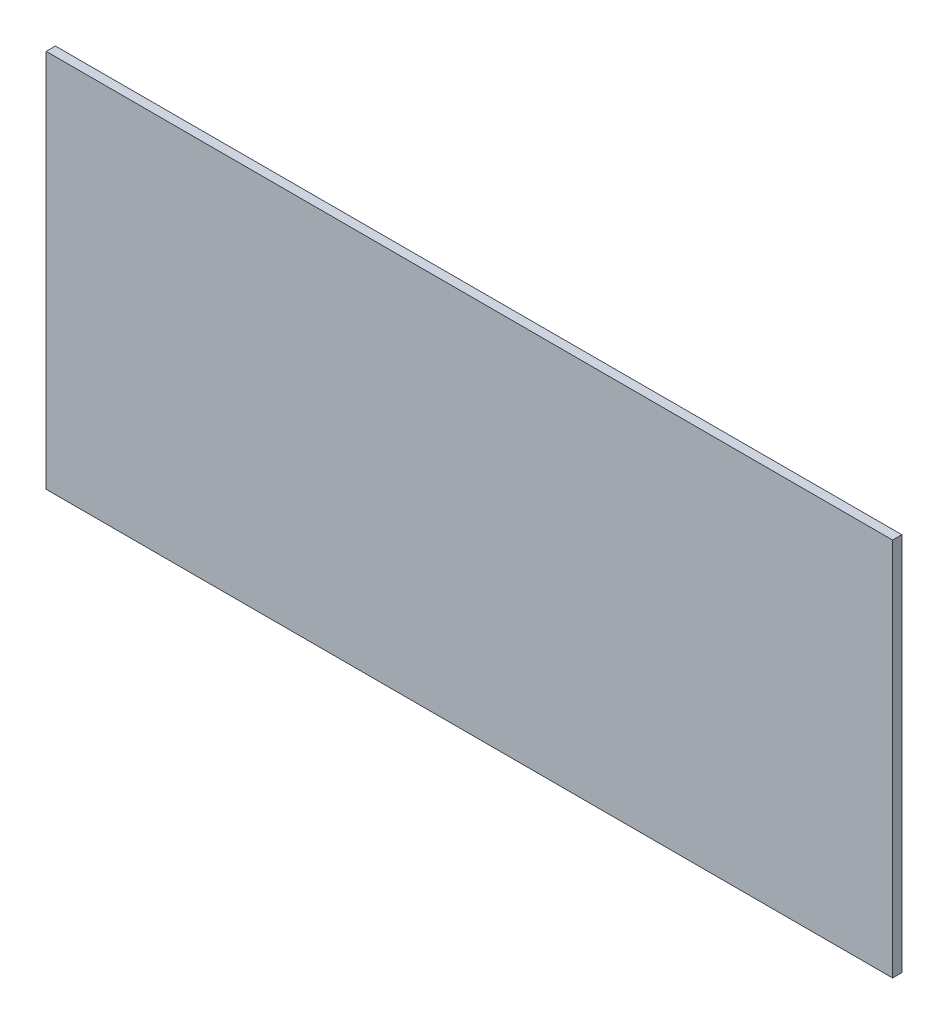
ISO-10303-21;
HEADER;
FILE_DESCRIPTION(('STEP AP214'),'2;1');
FILE_NAME('part.step','',(''),(''),'','','');
FILE_SCHEMA(('AUTOMOTIVE_DESIGN { 1 0 10303 214 1 1 1 1 }'));
ENDSEC;
DATA;
#1=APPLICATION_CONTEXT('core data for automotive mechanical design processes');
#2=APPLICATION_PROTOCOL_DEFINITION('international standard','automotive_design',2000,#1);
#3=PRODUCT_CONTEXT('',#1,'mechanical');
#4=PRODUCT('Part','Part','',(#3));
#5=PRODUCT_RELATED_PRODUCT_CATEGORY('part','',(#4));
#6=PRODUCT_DEFINITION_FORMATION('','',#4);
#7=PRODUCT_DEFINITION_CONTEXT('part definition',#1,'design');
#8=PRODUCT_DEFINITION('design','',#6,#7);
#9=PRODUCT_DEFINITION_SHAPE('','',#8);
#10=(LENGTH_UNIT() NAMED_UNIT(*) SI_UNIT(.MILLI.,.METRE.));
#11=(NAMED_UNIT(*) PLANE_ANGLE_UNIT() SI_UNIT($,.RADIAN.));
#12=(NAMED_UNIT(*) SI_UNIT($,.STERADIAN.) SOLID_ANGLE_UNIT());
#13=UNCERTAINTY_MEASURE_WITH_UNIT(LENGTH_MEASURE(1.E-05),#10,'distance_accuracy_value','');
#14=(GEOMETRIC_REPRESENTATION_CONTEXT(3) GLOBAL_UNCERTAINTY_ASSIGNED_CONTEXT((#13)) GLOBAL_UNIT_ASSIGNED_CONTEXT((#10,
#11,#12)) REPRESENTATION_CONTEXT('',''));
#15=CARTESIAN_POINT('',(0.,0.,0.));
#16=DIRECTION('',(0.,0.,1.));
#17=DIRECTION('',(1.,0.,0.));
#18=AXIS2_PLACEMENT_3D('',#15,#16,#17);
#19=CARTESIAN_POINT('',(-125.,-60.,151.));
#20=DIRECTION('',(1.,0.,0.));
#21=DIRECTION('',(0.,1.,0.));
#22=AXIS2_PLACEMENT_3D('',#19,#20,#21);
#23=PLANE('',#22);
#24=DIRECTION('',(0.,-1.,0.));
#25=VECTOR('',#24,1.);
#26=CARTESIAN_POINT('',(-125.,-60.,150.));
#27=LINE('',#26,#25);
#28=CARTESIAN_POINT('',(-125.,60.,150.));
#29=VERTEX_POINT('',#28);
#30=CARTESIAN_POINT('',(-125.,19.,150.));
#31=VERTEX_POINT('',#30);
#32=EDGE_CURVE('E99',#29,#31,#27,.T.);
#33=ORIENTED_EDGE('',*,*,#32,.T.);
#34=DIRECTION('',(0.,0.,1.));
#35=VECTOR('',#34,1.);
#36=CARTESIAN_POINT('',(-125.,19.,141.));
#37=LINE('',#36,#35);
#38=CARTESIAN_POINT('',(-125.,19.,151.));
#39=VERTEX_POINT('',#38);
#40=EDGE_CURVE('E102',#31,#39,#37,.T.);
#41=ORIENTED_EDGE('',*,*,#40,.T.);
#42=DIRECTION('',(0.,-1.,0.));
#43=VECTOR('',#42,1.);
#44=CARTESIAN_POINT('',(-125.,-60.,151.));
#45=LINE('',#44,#43);
#46=CARTESIAN_POINT('',(-125.,60.,151.));
#47=VERTEX_POINT('',#46);
#48=EDGE_CURVE('E93',#47,#39,#45,.T.);
#49=ORIENTED_EDGE('',*,*,#48,.F.);
#50=DIRECTION('',(0.,0.,-1.));
#51=VECTOR('',#50,1.);
#52=CARTESIAN_POINT('',(-125.,60.,151.));
#53=LINE('',#52,#51);
#54=EDGE_CURVE('E91',#47,#29,#53,.T.);
#55=ORIENTED_EDGE('',*,*,#54,.T.);
#56=EDGE_LOOP('',(#33,#41,#49,#55));
#57=FACE_BOUND('',#56,.T.);
#58=ADVANCED_FACE('F39',(#57),#23,.F.);
#59=CARTESIAN_POINT('',(-125.,60.,151.));
#60=DIRECTION('',(0.,-1.,0.));
#61=DIRECTION('',(1.,0.,0.));
#62=AXIS2_PLACEMENT_3D('',#59,#60,#61);
#63=PLANE('',#62);
#64=DIRECTION('',(-1.,0.,0.));
#65=VECTOR('',#64,1.);
#66=CARTESIAN_POINT('',(-125.,60.,151.));
#67=LINE('',#66,#65);
#68=CARTESIAN_POINT('',(-33.5,60.,151.));
#69=VERTEX_POINT('',#68);
#70=EDGE_CURVE('E61',#69,#47,#67,.T.);
#71=ORIENTED_EDGE('',*,*,#70,.F.);
#72=DIRECTION('',(0.,0.,1.));
#73=VECTOR('',#72,1.);
#74=CARTESIAN_POINT('',(-33.5,60.,141.));
#75=LINE('',#74,#73);
#76=CARTESIAN_POINT('',(-33.5,60.,150.));
#77=VERTEX_POINT('',#76);
#78=EDGE_CURVE('E78',#77,#69,#75,.T.);
#79=ORIENTED_EDGE('',*,*,#78,.F.);
#80=DIRECTION('',(-1.,0.,0.));
#81=VECTOR('',#80,1.);
#82=CARTESIAN_POINT('',(-125.,60.,150.));
#83=LINE('',#82,#81);
#84=EDGE_CURVE('E96',#77,#29,#83,.T.);
#85=ORIENTED_EDGE('',*,*,#84,.T.);
#86=ORIENTED_EDGE('',*,*,#54,.F.);
#87=EDGE_LOOP('',(#71,#79,#85,#86));
#88=FACE_BOUND('',#87,.T.);
#89=ADVANCED_FACE('F89',(#88),#63,.F.);
#90=CARTESIAN_POINT('',(0.,0.,151.));
#91=DIRECTION('',(0.,0.,-1.));
#92=DIRECTION('',(-1.,0.,0.));
#93=AXIS2_PLACEMENT_3D('',#90,#91,#92);
#94=PLANE('',#93);
#95=ORIENTED_EDGE('',*,*,#48,.T.);
#96=DIRECTION('',(-1.,0.,0.));
#97=VECTOR('',#96,1.);
#98=CARTESIAN_POINT('',(-125.,19.,151.));
#99=LINE('',#98,#97);
#100=CARTESIAN_POINT('',(-33.5,19.,151.));
#101=VERTEX_POINT('',#100);
#102=EDGE_CURVE('E85',#101,#39,#99,.T.);
#103=ORIENTED_EDGE('',*,*,#102,.F.);
#104=DIRECTION('',(0.,-1.,0.));
#105=VECTOR('',#104,1.);
#106=CARTESIAN_POINT('',(-33.5,60.,151.));
#107=LINE('',#106,#105);
#108=EDGE_CURVE('E80',#69,#101,#107,.T.);
#109=ORIENTED_EDGE('',*,*,#108,.F.);
#110=ORIENTED_EDGE('',*,*,#70,.T.);
#111=EDGE_LOOP('',(#95,#103,#109,#110));
#112=FACE_BOUND('',#111,.T.);
#113=ADVANCED_FACE('F87',(#112),#94,.F.);
#114=CARTESIAN_POINT('',(0.,0.,150.));
#115=DIRECTION('',(0.,0.,-1.));
#116=DIRECTION('',(-1.,0.,0.));
#117=AXIS2_PLACEMENT_3D('',#114,#115,#116);
#118=PLANE('',#117);
#119=DIRECTION('',(1.,0.,0.));
#120=VECTOR('',#119,1.);
#121=CARTESIAN_POINT('',(0.,19.,150.));
#122=LINE('',#121,#120);
#123=CARTESIAN_POINT('',(-33.5,19.,150.));
#124=VERTEX_POINT('',#123);
#125=EDGE_CURVE('E11',#31,#124,#122,.T.);
#126=ORIENTED_EDGE('',*,*,#125,.F.);
#127=ORIENTED_EDGE('',*,*,#32,.F.);
#128=ORIENTED_EDGE('',*,*,#84,.F.);
#129=DIRECTION('',(0.,1.,0.));
#130=VECTOR('',#129,1.);
#131=CARTESIAN_POINT('',(-33.5,0.,150.));
#132=LINE('',#131,#130);
#133=EDGE_CURVE('E46',#124,#77,#132,.T.);
#134=ORIENTED_EDGE('',*,*,#133,.F.);
#135=EDGE_LOOP('',(#126,#127,#128,#134));
#136=FACE_BOUND('',#135,.T.);
#137=ADVANCED_FACE('F108',(#136),#118,.T.);
#138=CARTESIAN_POINT('',(-125.,19.,141.));
#139=DIRECTION('',(0.,1.,0.));
#140=DIRECTION('',(-1.,0.,0.));
#141=AXIS2_PLACEMENT_3D('',#138,#139,#140);
#142=PLANE('',#141);
#143=ORIENTED_EDGE('',*,*,#125,.T.);
#144=DIRECTION('',(0.,0.,1.));
#145=VECTOR('',#144,1.);
#146=CARTESIAN_POINT('',(-33.5,19.,141.));
#147=LINE('',#146,#145);
#148=EDGE_CURVE('E53',#124,#101,#147,.T.);
#149=ORIENTED_EDGE('',*,*,#148,.T.);
#150=ORIENTED_EDGE('',*,*,#102,.T.);
#151=ORIENTED_EDGE('',*,*,#40,.F.);
#152=EDGE_LOOP('',(#143,#149,#150,#151));
#153=FACE_BOUND('',#152,.T.);
#154=ADVANCED_FACE('F110',(#153),#142,.F.);
#155=CARTESIAN_POINT('',(-33.5,60.,141.));
#156=DIRECTION('',(-1.,0.,0.));
#157=DIRECTION('',(0.,0.,1.));
#158=AXIS2_PLACEMENT_3D('',#155,#156,#157);
#159=PLANE('',#158);
#160=ORIENTED_EDGE('',*,*,#133,.T.);
#161=ORIENTED_EDGE('',*,*,#78,.T.);
#162=ORIENTED_EDGE('',*,*,#108,.T.);
#163=ORIENTED_EDGE('',*,*,#148,.F.);
#164=EDGE_LOOP('',(#160,#161,#162,#163));
#165=FACE_BOUND('',#164,.T.);
#166=ADVANCED_FACE('F79',(#165),#159,.F.);
#167=CLOSED_SHELL('',(#58,#89,#113,#137,#154,#166));
#168=MANIFOLD_SOLID_BREP('B2',#167);
#169=ADVANCED_BREP_SHAPE_REPRESENTATION('',(#18,#168),#14);
#170=SHAPE_DEFINITION_REPRESENTATION(#9,#169);
ENDSEC;
END-ISO-10303-21;
